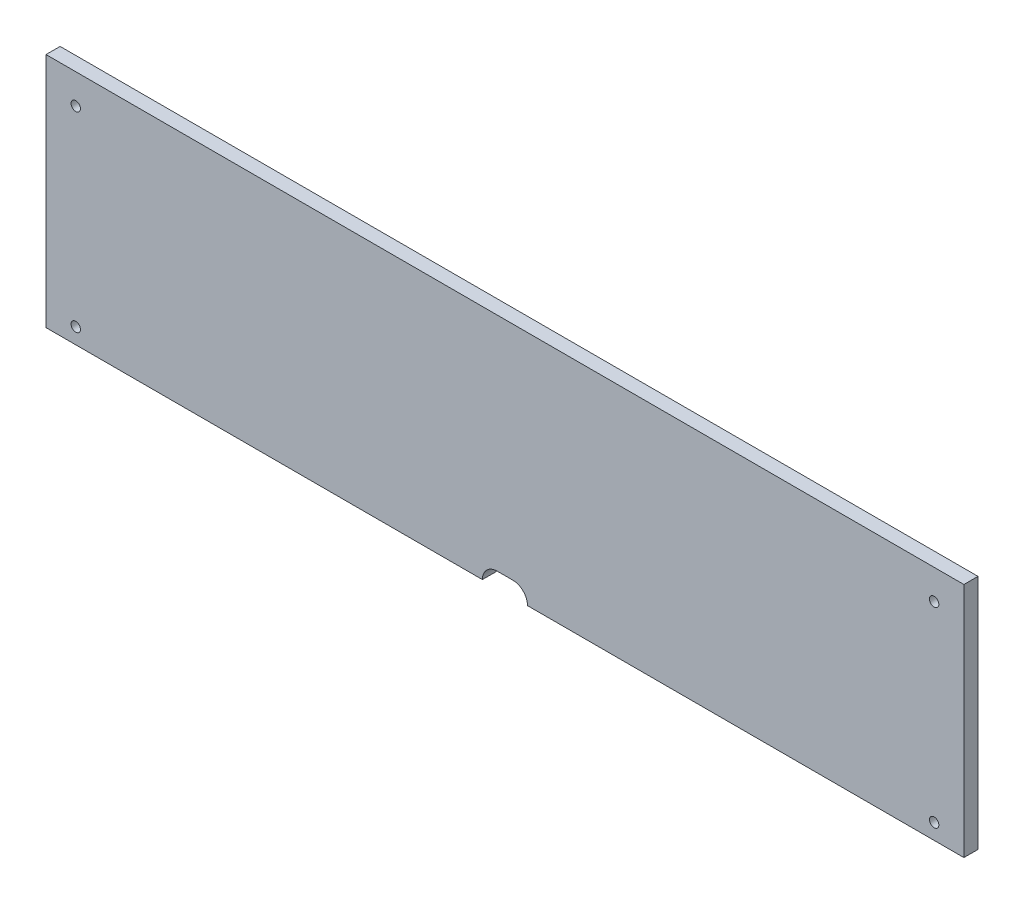
ISO-10303-21;
HEADER;
FILE_DESCRIPTION(('STEP AP214'),'2;1');
FILE_NAME('part.step','',(''),(''),'','','');
FILE_SCHEMA(('AUTOMOTIVE_DESIGN { 1 0 10303 214 1 1 1 1 }'));
ENDSEC;
DATA;
#1=APPLICATION_CONTEXT('core data for automotive mechanical design processes');
#2=APPLICATION_PROTOCOL_DEFINITION('international standard','automotive_design',2000,#1);
#3=PRODUCT_CONTEXT('',#1,'mechanical');
#4=PRODUCT('Part','Part','',(#3));
#5=PRODUCT_RELATED_PRODUCT_CATEGORY('part','',(#4));
#6=PRODUCT_DEFINITION_FORMATION('','',#4);
#7=PRODUCT_DEFINITION_CONTEXT('part definition',#1,'design');
#8=PRODUCT_DEFINITION('design','',#6,#7);
#9=PRODUCT_DEFINITION_SHAPE('','',#8);
#10=(LENGTH_UNIT() NAMED_UNIT(*) SI_UNIT(.MILLI.,.METRE.));
#11=(NAMED_UNIT(*) PLANE_ANGLE_UNIT() SI_UNIT($,.RADIAN.));
#12=(NAMED_UNIT(*) SI_UNIT($,.STERADIAN.) SOLID_ANGLE_UNIT());
#13=UNCERTAINTY_MEASURE_WITH_UNIT(LENGTH_MEASURE(1.E-05),#10,'distance_accuracy_value','');
#14=(GEOMETRIC_REPRESENTATION_CONTEXT(3) GLOBAL_UNCERTAINTY_ASSIGNED_CONTEXT((#13)) GLOBAL_UNIT_ASSIGNED_CONTEXT((#10,
#11,#12)) REPRESENTATION_CONTEXT('',''));
#15=CARTESIAN_POINT('',(0.,0.,0.));
#16=DIRECTION('',(0.,0.,1.));
#17=DIRECTION('',(1.,0.,0.));
#18=AXIS2_PLACEMENT_3D('',#15,#16,#17);
#19=CARTESIAN_POINT('',(146.5,-37.75,4.5));
#20=DIRECTION('',(0.,-1.,0.));
#21=DIRECTION('',(1.,0.,0.));
#22=AXIS2_PLACEMENT_3D('',#19,#20,#21);
#23=PLANE('',#22);
#24=DIRECTION('',(0.,0.,1.));
#25=VECTOR('',#24,1.);
#26=CARTESIAN_POINT('',(7.19993840076541,-37.75,-0.00100000000000013));
#27=LINE('',#26,#25);
#28=CARTESIAN_POINT('',(7.19993840076541,-37.75,4.5));
#29=VERTEX_POINT('',#28);
#30=CARTESIAN_POINT('',(7.19993840076541,-37.75,0.));
#31=VERTEX_POINT('',#30);
#32=EDGE_CURVE('E109',#29,#31,#27,.F.);
#33=ORIENTED_EDGE('',*,*,#32,.T.);
#34=DIRECTION('',(-1.,0.,0.));
#35=VECTOR('',#34,1.);
#36=CARTESIAN_POINT('',(146.5,-37.75,0.));
#37=LINE('',#36,#35);
#38=CARTESIAN_POINT('',(146.5,-37.75,0.));
#39=VERTEX_POINT('',#38);
#40=EDGE_CURVE('E118',#39,#31,#37,.T.);
#41=ORIENTED_EDGE('',*,*,#40,.F.);
#42=DIRECTION('',(0.,0.,-1.));
#43=VECTOR('',#42,1.);
#44=CARTESIAN_POINT('',(146.5,-37.75,4.5));
#45=LINE('',#44,#43);
#46=CARTESIAN_POINT('',(146.5,-37.75,4.5));
#47=VERTEX_POINT('',#46);
#48=EDGE_CURVE('E56',#47,#39,#45,.T.);
#49=ORIENTED_EDGE('',*,*,#48,.F.);
#50=DIRECTION('',(-1.,0.,0.));
#51=VECTOR('',#50,1.);
#52=CARTESIAN_POINT('',(146.5,-37.75,4.5));
#53=LINE('',#52,#51);
#54=EDGE_CURVE('E120',#47,#29,#53,.T.);
#55=ORIENTED_EDGE('',*,*,#54,.T.);
#56=EDGE_LOOP('',(#33,#41,#49,#55));
#57=FACE_BOUND('',#56,.T.);
#58=ADVANCED_FACE('F32',(#57),#23,.T.);
#59=CARTESIAN_POINT('',(146.5,-37.75,4.5));
#60=DIRECTION('',(-1.,0.,0.));
#61=DIRECTION('',(0.,0.,1.));
#62=AXIS2_PLACEMENT_3D('',#59,#60,#61);
#63=PLANE('',#62);
#64=DIRECTION('',(0.,1.,0.));
#65=VECTOR('',#64,1.);
#66=CARTESIAN_POINT('',(146.5,-37.75,0.));
#67=LINE('',#66,#65);
#68=CARTESIAN_POINT('',(146.5,37.75,0.));
#69=VERTEX_POINT('',#68);
#70=EDGE_CURVE('E123',#39,#69,#67,.T.);
#71=ORIENTED_EDGE('',*,*,#70,.T.);
#72=DIRECTION('',(0.,0.,-1.));
#73=VECTOR('',#72,1.);
#74=CARTESIAN_POINT('',(146.5,37.75,4.5));
#75=LINE('',#74,#73);
#76=CARTESIAN_POINT('',(146.5,37.75,4.5));
#77=VERTEX_POINT('',#76);
#78=EDGE_CURVE('E11',#77,#69,#75,.T.);
#79=ORIENTED_EDGE('',*,*,#78,.F.);
#80=DIRECTION('',(0.,1.,0.));
#81=VECTOR('',#80,1.);
#82=CARTESIAN_POINT('',(146.5,-37.75,4.5));
#83=LINE('',#82,#81);
#84=EDGE_CURVE('E124',#47,#77,#83,.T.);
#85=ORIENTED_EDGE('',*,*,#84,.F.);
#86=ORIENTED_EDGE('',*,*,#48,.T.);
#87=EDGE_LOOP('',(#71,#79,#85,#86));
#88=FACE_BOUND('',#87,.T.);
#89=ADVANCED_FACE('F34',(#88),#63,.F.);
#90=CARTESIAN_POINT('',(146.5,37.75,4.5));
#91=DIRECTION('',(0.,-1.,0.));
#92=DIRECTION('',(1.,0.,0.));
#93=AXIS2_PLACEMENT_3D('',#90,#91,#92);
#94=PLANE('',#93);
#95=DIRECTION('',(-1.,0.,0.));
#96=VECTOR('',#95,1.);
#97=CARTESIAN_POINT('',(146.5,37.75,0.));
#98=LINE('',#97,#96);
#99=CARTESIAN_POINT('',(-146.5,37.75,0.));
#100=VERTEX_POINT('',#99);
#101=EDGE_CURVE('E144',#69,#100,#98,.T.);
#102=ORIENTED_EDGE('',*,*,#101,.T.);
#103=DIRECTION('',(0.,0.,-1.));
#104=VECTOR('',#103,1.);
#105=CARTESIAN_POINT('',(-146.5,37.75,4.5));
#106=LINE('',#105,#104);
#107=CARTESIAN_POINT('',(-146.5,37.75,4.5));
#108=VERTEX_POINT('',#107);
#109=EDGE_CURVE('E40',#108,#100,#106,.T.);
#110=ORIENTED_EDGE('',*,*,#109,.F.);
#111=DIRECTION('',(-1.,0.,0.));
#112=VECTOR('',#111,1.);
#113=CARTESIAN_POINT('',(146.5,37.75,4.5));
#114=LINE('',#113,#112);
#115=EDGE_CURVE('E82',#77,#108,#114,.T.);
#116=ORIENTED_EDGE('',*,*,#115,.F.);
#117=ORIENTED_EDGE('',*,*,#78,.T.);
#118=EDGE_LOOP('',(#102,#110,#116,#117));
#119=FACE_BOUND('',#118,.T.);
#120=ADVANCED_FACE('F145',(#119),#94,.F.);
#121=CARTESIAN_POINT('',(-146.5,-37.75,4.5));
#122=DIRECTION('',(-1.,0.,0.));
#123=DIRECTION('',(0.,0.,1.));
#124=AXIS2_PLACEMENT_3D('',#121,#122,#123);
#125=PLANE('',#124);
#126=DIRECTION('',(0.,1.,0.));
#127=VECTOR('',#126,1.);
#128=CARTESIAN_POINT('',(-146.5,-37.75,0.));
#129=LINE('',#128,#127);
#130=CARTESIAN_POINT('',(-146.5,-37.75,0.));
#131=VERTEX_POINT('',#130);
#132=EDGE_CURVE('E128',#131,#100,#129,.T.);
#133=ORIENTED_EDGE('',*,*,#132,.F.);
#134=DIRECTION('',(0.,0.,-1.));
#135=VECTOR('',#134,1.);
#136=CARTESIAN_POINT('',(-146.5,-37.75,4.5));
#137=LINE('',#136,#135);
#138=CARTESIAN_POINT('',(-146.5,-37.75,4.5));
#139=VERTEX_POINT('',#138);
#140=EDGE_CURVE('E133',#139,#131,#137,.T.);
#141=ORIENTED_EDGE('',*,*,#140,.F.);
#142=DIRECTION('',(0.,1.,0.));
#143=VECTOR('',#142,1.);
#144=CARTESIAN_POINT('',(-146.5,-37.75,4.5));
#145=LINE('',#144,#143);
#146=EDGE_CURVE('E143',#139,#108,#145,.T.);
#147=ORIENTED_EDGE('',*,*,#146,.T.);
#148=ORIENTED_EDGE('',*,*,#109,.T.);
#149=EDGE_LOOP('',(#133,#141,#147,#148));
#150=FACE_BOUND('',#149,.T.);
#151=ADVANCED_FACE('F139',(#150),#125,.T.);
#152=DIRECTION('',(0.,0.,1.));
#153=VECTOR('',#152,1.);
#154=CARTESIAN_POINT('',(-7.19993840076541,-37.75,-0.00100000000000013));
#155=LINE('',#154,#153);
#156=CARTESIAN_POINT('',(-7.19993840076541,-37.75,0.));
#157=VERTEX_POINT('',#156);
#158=CARTESIAN_POINT('',(-7.19993840076541,-37.75,4.5));
#159=VERTEX_POINT('',#158);
#160=EDGE_CURVE('E47',#157,#159,#155,.T.);
#161=ORIENTED_EDGE('',*,*,#160,.T.);
#162=EDGE_CURVE('E151',#159,#139,#53,.T.);
#163=ORIENTED_EDGE('',*,*,#162,.T.);
#164=ORIENTED_EDGE('',*,*,#140,.T.);
#165=EDGE_CURVE('E125',#157,#131,#37,.T.);
#166=ORIENTED_EDGE('',*,*,#165,.F.);
#167=EDGE_LOOP('',(#161,#163,#164,#166));
#168=FACE_BOUND('',#167,.T.);
#169=ADVANCED_FACE('F149',(#168),#23,.T.);
#170=CARTESIAN_POINT('',(0.,0.,4.5));
#171=DIRECTION('',(0.,0.,1.));
#172=DIRECTION('',(1.,0.,0.));
#173=AXIS2_PLACEMENT_3D('',#170,#171,#172);
#174=PLANE('',#173);
#175=CARTESIAN_POINT('',(137.,-32.75,4.5));
#176=DIRECTION('',(0.,0.,1.));
#177=DIRECTION('',(1.,0.,0.));
#178=AXIS2_PLACEMENT_3D('',#175,#176,#177);
#179=CIRCLE('',#178,1.5);
#180=CARTESIAN_POINT('',(138.5,-32.75,4.5));
#181=VERTEX_POINT('',#180);
#182=EDGE_CURVE('E193',#181,#181,#179,.T.);
#183=ORIENTED_EDGE('',*,*,#182,.F.);
#184=EDGE_LOOP('',(#183));
#185=FACE_BOUND('',#184,.T.);
#186=CARTESIAN_POINT('',(-137.,-32.75,4.5));
#187=DIRECTION('',(0.,0.,1.));
#188=DIRECTION('',(1.,0.,0.));
#189=AXIS2_PLACEMENT_3D('',#186,#187,#188);
#190=CIRCLE('',#189,1.5);
#191=CARTESIAN_POINT('',(-135.5,-32.75,4.5));
#192=VERTEX_POINT('',#191);
#193=EDGE_CURVE('E192',#192,#192,#190,.T.);
#194=ORIENTED_EDGE('',*,*,#193,.F.);
#195=EDGE_LOOP('',(#194));
#196=FACE_BOUND('',#195,.T.);
#197=CARTESIAN_POINT('',(2.5,-37.75,4.5));
#198=DIRECTION('',(0.,0.,1.));
#199=DIRECTION('',(1.,0.,0.));
#200=AXIS2_PLACEMENT_3D('',#197,#198,#199);
#201=CIRCLE('',#200,4.69993840076541);
#202=CARTESIAN_POINT('',(2.5,-33.0500615992346,4.5));
#203=VERTEX_POINT('',#202);
#204=EDGE_CURVE('E115',#29,#203,#201,.T.);
#205=ORIENTED_EDGE('',*,*,#204,.F.);
#206=ORIENTED_EDGE('',*,*,#54,.F.);
#207=ORIENTED_EDGE('',*,*,#84,.T.);
#208=ORIENTED_EDGE('',*,*,#115,.T.);
#209=ORIENTED_EDGE('',*,*,#146,.F.);
#210=ORIENTED_EDGE('',*,*,#162,.F.);
#211=CARTESIAN_POINT('',(-2.5,-37.75,4.5));
#212=DIRECTION('',(0.,0.,1.));
#213=DIRECTION('',(1.,0.,0.));
#214=AXIS2_PLACEMENT_3D('',#211,#212,#213);
#215=CIRCLE('',#214,4.69993840076541);
#216=CARTESIAN_POINT('',(-2.5,-33.0500615992346,4.5));
#217=VERTEX_POINT('',#216);
#218=EDGE_CURVE('E175',#217,#159,#215,.T.);
#219=ORIENTED_EDGE('',*,*,#218,.F.);
#220=DIRECTION('',(-1.,0.,0.));
#221=VECTOR('',#220,1.);
#222=CARTESIAN_POINT('',(2.5,-33.0500615992346,4.5));
#223=LINE('',#222,#221);
#224=EDGE_CURVE('E178',#203,#217,#223,.T.);
#225=ORIENTED_EDGE('',*,*,#224,.F.);
#226=EDGE_LOOP('',(#205,#206,#207,#208,#209,#210,#219,#225));
#227=FACE_BOUND('',#226,.T.);
#228=CARTESIAN_POINT('',(-137.,28.25,4.5));
#229=DIRECTION('',(0.,0.,1.));
#230=DIRECTION('',(1.,0.,0.));
#231=AXIS2_PLACEMENT_3D('',#228,#229,#230);
#232=CIRCLE('',#231,1.5);
#233=CARTESIAN_POINT('',(-135.5,28.25,4.5));
#234=VERTEX_POINT('',#233);
#235=EDGE_CURVE('E172',#234,#234,#232,.T.);
#236=ORIENTED_EDGE('',*,*,#235,.F.);
#237=EDGE_LOOP('',(#236));
#238=FACE_BOUND('',#237,.T.);
#239=CARTESIAN_POINT('',(137.,28.25,4.5));
#240=DIRECTION('',(0.,0.,1.));
#241=DIRECTION('',(1.,0.,0.));
#242=AXIS2_PLACEMENT_3D('',#239,#240,#241);
#243=CIRCLE('',#242,1.5);
#244=CARTESIAN_POINT('',(138.5,28.25,4.5));
#245=VERTEX_POINT('',#244);
#246=EDGE_CURVE('E162',#245,#245,#243,.T.);
#247=ORIENTED_EDGE('',*,*,#246,.F.);
#248=EDGE_LOOP('',(#247));
#249=FACE_BOUND('',#248,.T.);
#250=ADVANCED_FACE('F153',(#185,#196,#227,#238,#249),#174,.T.);
#251=CARTESIAN_POINT('',(0.,0.,0.));
#252=DIRECTION('',(0.,0.,1.));
#253=DIRECTION('',(1.,0.,0.));
#254=AXIS2_PLACEMENT_3D('',#251,#252,#253);
#255=PLANE('',#254);
#256=CARTESIAN_POINT('',(137.,-32.75,0.));
#257=DIRECTION('',(0.,0.,1.));
#258=DIRECTION('',(1.,0.,0.));
#259=AXIS2_PLACEMENT_3D('',#256,#257,#258);
#260=CIRCLE('',#259,1.5);
#261=CARTESIAN_POINT('',(138.5,-32.75,0.));
#262=VERTEX_POINT('',#261);
#263=EDGE_CURVE('E189',#262,#262,#260,.F.);
#264=ORIENTED_EDGE('',*,*,#263,.F.);
#265=EDGE_LOOP('',(#264));
#266=FACE_BOUND('',#265,.T.);
#267=CARTESIAN_POINT('',(-137.,-32.75,0.));
#268=DIRECTION('',(0.,0.,1.));
#269=DIRECTION('',(1.,0.,0.));
#270=AXIS2_PLACEMENT_3D('',#267,#268,#269);
#271=CIRCLE('',#270,1.5);
#272=CARTESIAN_POINT('',(-135.5,-32.75,0.));
#273=VERTEX_POINT('',#272);
#274=EDGE_CURVE('E184',#273,#273,#271,.F.);
#275=ORIENTED_EDGE('',*,*,#274,.F.);
#276=EDGE_LOOP('',(#275));
#277=FACE_BOUND('',#276,.T.);
#278=CARTESIAN_POINT('',(-137.,28.25,0.));
#279=DIRECTION('',(0.,0.,1.));
#280=DIRECTION('',(1.,0.,0.));
#281=AXIS2_PLACEMENT_3D('',#278,#279,#280);
#282=CIRCLE('',#281,1.5);
#283=CARTESIAN_POINT('',(-135.5,28.25,0.));
#284=VERTEX_POINT('',#283);
#285=EDGE_CURVE('E167',#284,#284,#282,.F.);
#286=ORIENTED_EDGE('',*,*,#285,.F.);
#287=EDGE_LOOP('',(#286));
#288=FACE_BOUND('',#287,.T.);
#289=CARTESIAN_POINT('',(137.,28.25,0.));
#290=DIRECTION('',(0.,0.,1.));
#291=DIRECTION('',(1.,0.,0.));
#292=AXIS2_PLACEMENT_3D('',#289,#290,#291);
#293=CIRCLE('',#292,1.5);
#294=CARTESIAN_POINT('',(138.5,28.25,0.));
#295=VERTEX_POINT('',#294);
#296=EDGE_CURVE('E160',#295,#295,#293,.F.);
#297=ORIENTED_EDGE('',*,*,#296,.F.);
#298=EDGE_LOOP('',(#297));
#299=FACE_BOUND('',#298,.T.);
#300=ORIENTED_EDGE('',*,*,#40,.T.);
#301=CARTESIAN_POINT('',(2.5,-37.75,0.));
#302=DIRECTION('',(0.,0.,1.));
#303=DIRECTION('',(1.,0.,0.));
#304=AXIS2_PLACEMENT_3D('',#301,#302,#303);
#305=CIRCLE('',#304,4.69993840076541);
#306=CARTESIAN_POINT('',(2.5,-33.0500615992346,0.));
#307=VERTEX_POINT('',#306);
#308=EDGE_CURVE('E105',#307,#31,#305,.F.);
#309=ORIENTED_EDGE('',*,*,#308,.F.);
#310=DIRECTION('',(1.,0.,0.));
#311=VECTOR('',#310,1.);
#312=CARTESIAN_POINT('',(2.5,-33.0500615992346,0.));
#313=LINE('',#312,#311);
#314=CARTESIAN_POINT('',(-2.5,-33.0500615992346,0.));
#315=VERTEX_POINT('',#314);
#316=EDGE_CURVE('E170',#315,#307,#313,.T.);
#317=ORIENTED_EDGE('',*,*,#316,.F.);
#318=CARTESIAN_POINT('',(-2.5,-37.75,0.));
#319=DIRECTION('',(0.,0.,1.));
#320=DIRECTION('',(1.,0.,0.));
#321=AXIS2_PLACEMENT_3D('',#318,#319,#320);
#322=CIRCLE('',#321,4.69993840076541);
#323=EDGE_CURVE('E116',#157,#315,#322,.F.);
#324=ORIENTED_EDGE('',*,*,#323,.F.);
#325=ORIENTED_EDGE('',*,*,#165,.T.);
#326=ORIENTED_EDGE('',*,*,#132,.T.);
#327=ORIENTED_EDGE('',*,*,#101,.F.);
#328=ORIENTED_EDGE('',*,*,#70,.F.);
#329=EDGE_LOOP('',(#300,#309,#317,#324,#325,#326,#327,#328));
#330=FACE_BOUND('',#329,.T.);
#331=ADVANCED_FACE('F122',(#266,#277,#288,#299,#330),#255,.F.);
#332=CARTESIAN_POINT('',(137.,28.25,-0.00100000000000013));
#333=DIRECTION('',(0.,0.,1.));
#334=DIRECTION('',(1.,0.,0.));
#335=AXIS2_PLACEMENT_3D('',#332,#333,#334);
#336=CYLINDRICAL_SURFACE('',#335,1.5);
#337=ORIENTED_EDGE('',*,*,#246,.T.);
#338=EDGE_LOOP('',(#337));
#339=FACE_BOUND('',#338,.T.);
#340=ORIENTED_EDGE('',*,*,#296,.T.);
#341=EDGE_LOOP('',(#340));
#342=FACE_BOUND('',#341,.T.);
#343=ADVANCED_FACE('F211',(#339,#342),#336,.F.);
#344=CARTESIAN_POINT('',(-137.,28.25,-0.00100000000000013));
#345=DIRECTION('',(0.,0.,1.));
#346=DIRECTION('',(1.,0.,0.));
#347=AXIS2_PLACEMENT_3D('',#344,#345,#346);
#348=CYLINDRICAL_SURFACE('',#347,1.5);
#349=ORIENTED_EDGE('',*,*,#235,.T.);
#350=EDGE_LOOP('',(#349));
#351=FACE_BOUND('',#350,.T.);
#352=ORIENTED_EDGE('',*,*,#285,.T.);
#353=EDGE_LOOP('',(#352));
#354=FACE_BOUND('',#353,.T.);
#355=ADVANCED_FACE('F257',(#351,#354),#348,.F.);
#356=CARTESIAN_POINT('',(2.5,-33.0500615992346,-0.00100000000000013));
#357=DIRECTION('',(0.,1.,0.));
#358=DIRECTION('',(0.,0.,1.));
#359=AXIS2_PLACEMENT_3D('',#356,#357,#358);
#360=PLANE('',#359);
#361=ORIENTED_EDGE('',*,*,#316,.T.);
#362=DIRECTION('',(0.,0.,1.));
#363=VECTOR('',#362,1.);
#364=CARTESIAN_POINT('',(2.5,-33.0500615992346,-0.00100000000000013));
#365=LINE('',#364,#363);
#366=EDGE_CURVE('E111',#307,#203,#365,.T.);
#367=ORIENTED_EDGE('',*,*,#366,.T.);
#368=ORIENTED_EDGE('',*,*,#224,.T.);
#369=DIRECTION('',(0.,0.,1.));
#370=VECTOR('',#369,1.);
#371=CARTESIAN_POINT('',(-2.5,-33.0500615992346,-0.00100000000000013));
#372=LINE('',#371,#370);
#373=EDGE_CURVE('E173',#315,#217,#372,.T.);
#374=ORIENTED_EDGE('',*,*,#373,.F.);
#375=EDGE_LOOP('',(#361,#367,#368,#374));
#376=FACE_BOUND('',#375,.T.);
#377=ADVANCED_FACE('F266',(#376),#360,.F.);
#378=CARTESIAN_POINT('',(2.5,-37.75,-0.00100000000000013));
#379=DIRECTION('',(0.,0.,1.));
#380=DIRECTION('',(1.,0.,0.));
#381=AXIS2_PLACEMENT_3D('',#378,#379,#380);
#382=CYLINDRICAL_SURFACE('',#381,4.69993840076541);
#383=ORIENTED_EDGE('',*,*,#204,.T.);
#384=ORIENTED_EDGE('',*,*,#366,.F.);
#385=ORIENTED_EDGE('',*,*,#308,.T.);
#386=ORIENTED_EDGE('',*,*,#32,.F.);
#387=EDGE_LOOP('',(#383,#384,#385,#386));
#388=FACE_BOUND('',#387,.T.);
#389=ADVANCED_FACE('F108',(#388),#382,.F.);
#390=CARTESIAN_POINT('',(-2.5,-37.75,-0.00100000000000013));
#391=DIRECTION('',(0.,0.,1.));
#392=DIRECTION('',(1.,0.,0.));
#393=AXIS2_PLACEMENT_3D('',#390,#391,#392);
#394=CYLINDRICAL_SURFACE('',#393,4.69993840076541);
#395=ORIENTED_EDGE('',*,*,#323,.T.);
#396=ORIENTED_EDGE('',*,*,#373,.T.);
#397=ORIENTED_EDGE('',*,*,#218,.T.);
#398=ORIENTED_EDGE('',*,*,#160,.F.);
#399=EDGE_LOOP('',(#395,#396,#397,#398));
#400=FACE_BOUND('',#399,.T.);
#401=ADVANCED_FACE('F285',(#400),#394,.F.);
#402=CARTESIAN_POINT('',(-137.,-32.75,-0.00100000000000013));
#403=DIRECTION('',(0.,0.,1.));
#404=DIRECTION('',(1.,0.,0.));
#405=AXIS2_PLACEMENT_3D('',#402,#403,#404);
#406=CYLINDRICAL_SURFACE('',#405,1.5);
#407=ORIENTED_EDGE('',*,*,#193,.T.);
#408=EDGE_LOOP('',(#407));
#409=FACE_BOUND('',#408,.T.);
#410=ORIENTED_EDGE('',*,*,#274,.T.);
#411=EDGE_LOOP('',(#410));
#412=FACE_BOUND('',#411,.T.);
#413=ADVANCED_FACE('F201',(#409,#412),#406,.F.);
#414=CARTESIAN_POINT('',(137.,-32.75,-0.00100000000000013));
#415=DIRECTION('',(0.,0.,1.));
#416=DIRECTION('',(1.,0.,0.));
#417=AXIS2_PLACEMENT_3D('',#414,#415,#416);
#418=CYLINDRICAL_SURFACE('',#417,1.5);
#419=ORIENTED_EDGE('',*,*,#182,.T.);
#420=EDGE_LOOP('',(#419));
#421=FACE_BOUND('',#420,.T.);
#422=ORIENTED_EDGE('',*,*,#263,.T.);
#423=EDGE_LOOP('',(#422));
#424=FACE_BOUND('',#423,.T.);
#425=ADVANCED_FACE('F302',(#421,#424),#418,.F.);
#426=CLOSED_SHELL('',(#58,#89,#120,#151,#169,#250,#331,#343,#355,#377,#389,#401,#413,#425));
#427=MANIFOLD_SOLID_BREP('B2',#426);
#428=ADVANCED_BREP_SHAPE_REPRESENTATION('',(#18,#427),#14);
#429=SHAPE_DEFINITION_REPRESENTATION(#9,#428);
ENDSEC;
END-ISO-10303-21;
